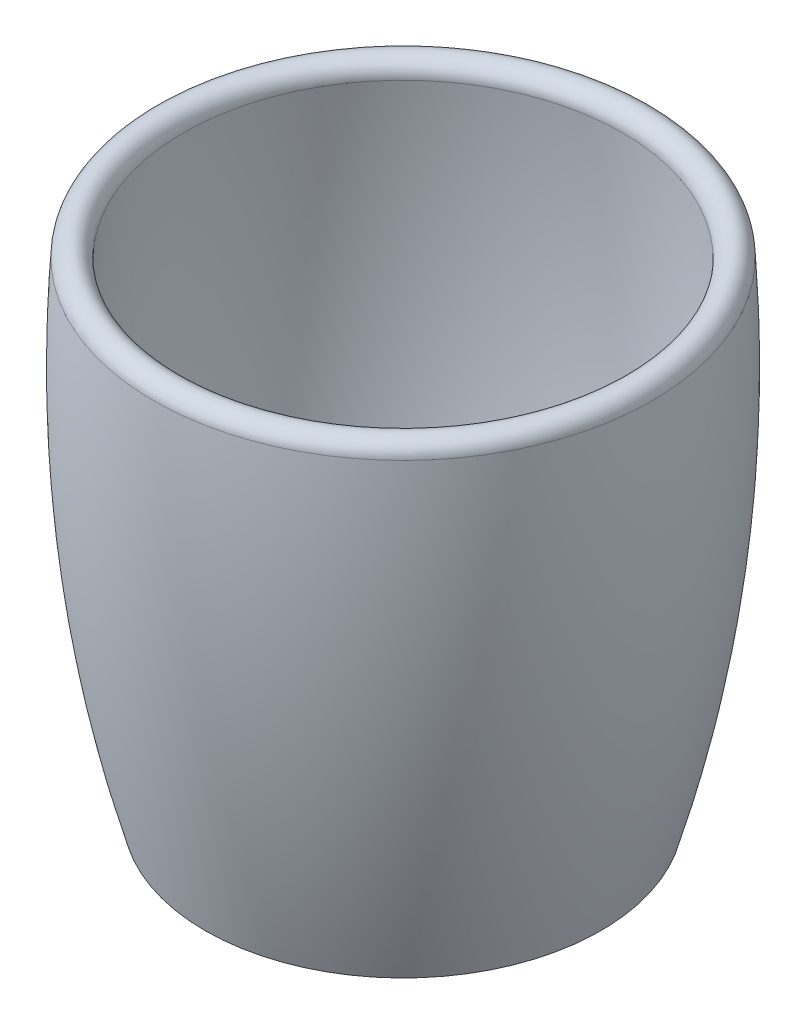
ISO-10303-21;
HEADER;
FILE_DESCRIPTION(('STEP AP214'),'2;1');
FILE_NAME('part.step','',(''),(''),'','','');
FILE_SCHEMA(('AUTOMOTIVE_DESIGN { 1 0 10303 214 1 1 1 1 }'));
ENDSEC;
DATA;
#1=APPLICATION_CONTEXT('core data for automotive mechanical design processes');
#2=APPLICATION_PROTOCOL_DEFINITION('international standard','automotive_design',2000,#1);
#3=PRODUCT_CONTEXT('',#1,'mechanical');
#4=PRODUCT('Part','Part','',(#3));
#5=PRODUCT_RELATED_PRODUCT_CATEGORY('part','',(#4));
#6=PRODUCT_DEFINITION_FORMATION('','',#4);
#7=PRODUCT_DEFINITION_CONTEXT('part definition',#1,'design');
#8=PRODUCT_DEFINITION('design','',#6,#7);
#9=PRODUCT_DEFINITION_SHAPE('','',#8);
#10=(LENGTH_UNIT() NAMED_UNIT(*) SI_UNIT(.MILLI.,.METRE.));
#11=(NAMED_UNIT(*) PLANE_ANGLE_UNIT() SI_UNIT($,.RADIAN.));
#12=(NAMED_UNIT(*) SI_UNIT($,.STERADIAN.) SOLID_ANGLE_UNIT());
#13=UNCERTAINTY_MEASURE_WITH_UNIT(LENGTH_MEASURE(1.E-05),#10,'distance_accuracy_value','');
#14=(GEOMETRIC_REPRESENTATION_CONTEXT(3) GLOBAL_UNCERTAINTY_ASSIGNED_CONTEXT((#13)) GLOBAL_UNIT_ASSIGNED_CONTEXT((#10,
#11,#12)) REPRESENTATION_CONTEXT('',''));
#15=CARTESIAN_POINT('',(0.,0.,0.));
#16=DIRECTION('',(0.,0.,1.));
#17=DIRECTION('',(1.,0.,0.));
#18=AXIS2_PLACEMENT_3D('',#15,#16,#17);
#19=CARTESIAN_POINT('',(0.,5.,0.));
#20=DIRECTION('',(0.,1.,0.));
#21=DIRECTION('',(0.,0.,1.));
#22=AXIS2_PLACEMENT_3D('',#19,#20,#21);
#23=PLANE('',#22);
#24=CARTESIAN_POINT('',(0.,5.,0.));
#25=DIRECTION('',(0.,-1.,0.));
#26=DIRECTION('',(0.,0.,-1.));
#27=AXIS2_PLACEMENT_3D('',#24,#25,#26);
#28=CIRCLE('',#27,29.4504231524279);
#29=CARTESIAN_POINT('',(0.,5.,-29.4504231524279));
#30=VERTEX_POINT('',#29);
#31=EDGE_CURVE('E10',#30,#30,#28,.T.);
#32=ORIENTED_EDGE('',*,*,#31,.F.);
#33=EDGE_LOOP('',(#32));
#34=FACE_BOUND('',#33,.T.);
#35=ADVANCED_FACE('F33',(#34),#23,.T.);
#36=CARTESIAN_POINT('',(36.8601264484739,81.0819403518509,0.));
#37=CARTESIAN_POINT('',(37.06783674226,77.8232808287889,0.));
#38=CARTESIAN_POINT('',(37.3573213885303,71.2744584432907,0.));
#39=CARTESIAN_POINT('',(37.4144319666475,58.3463548968909,0.));
#40=CARTESIAN_POINT('',(36.5162777397363,42.3627053961325,0.));
#41=CARTESIAN_POINT('',(33.8900650254874,23.5134670461146,0.));
#42=CARTESIAN_POINT('',(31.0987213312191,11.1227311945635,0.));
#43=CARTESIAN_POINT('',(29.4504231524279,5.,0.));
#44=B_SPLINE_CURVE_WITH_KNOTS('',3,(#36,#37,#38,#39,#40,#41,#42,#43),.UNSPECIFIED.,.F.,.F.,(4,1,
1,1,1,4),(0.0469513690142024,0.166082447887427,0.285213526760652,0.523475684507101,
0.761737842253551,1.),.UNSPECIFIED.);
#45=CARTESIAN_POINT('',(0.,0.,0.));
#46=DIRECTION('',(0.,-1.,0.));
#47=AXIS1_PLACEMENT('',#45,#46);
#48=SURFACE_OF_REVOLUTION('',#44,#47);
#49=ORIENTED_EDGE('',*,*,#31,.T.);
#50=EDGE_LOOP('',(#49));
#51=FACE_BOUND('',#50,.T.);
#52=CARTESIAN_POINT('',(0.,81.0819403518509,0.));
#53=DIRECTION('',(0.,-1.,0.));
#54=DIRECTION('',(0.,0.,-1.));
#55=AXIS2_PLACEMENT_3D('',#52,#53,#54);
#56=CIRCLE('',#55,36.8601264484739);
#57=CARTESIAN_POINT('',(0.,81.0819403518509,-36.8601264484739));
#58=VERTEX_POINT('',#57);
#59=EDGE_CURVE('E39',#58,#58,#56,.T.);
#60=ORIENTED_EDGE('',*,*,#59,.F.);
#61=EDGE_LOOP('',(#60));
#62=FACE_BOUND('',#61,.T.);
#63=ADVANCED_FACE('F62',(#51,#62),#48,.F.);
#64=CARTESIAN_POINT('',(0.,81.2409701759254,0.));
#65=DIRECTION('',(0.,-1.,0.));
#66=DIRECTION('',(0.,0.,-1.));
#67=AXIS2_PLACEMENT_3D('',#64,#65,#66);
#68=TOROIDAL_SURFACE('',#67,39.355063224237,2.5);
#69=ORIENTED_EDGE('',*,*,#59,.T.);
#70=EDGE_LOOP('',(#69));
#71=FACE_BOUND('',#70,.T.);
#72=CARTESIAN_POINT('',(0.,81.4,0.));
#73=DIRECTION('',(0.,-1.,0.));
#74=DIRECTION('',(0.,0.,-1.));
#75=AXIS2_PLACEMENT_3D('',#72,#73,#74);
#76=CIRCLE('',#75,41.85);
#77=CARTESIAN_POINT('',(0.,81.4,-41.85));
#78=VERTEX_POINT('',#77);
#79=EDGE_CURVE('E43',#78,#78,#76,.T.);
#80=ORIENTED_EDGE('',*,*,#79,.F.);
#81=EDGE_LOOP('',(#80));
#82=FACE_BOUND('',#81,.T.);
#83=ADVANCED_FACE('F65',(#71,#82),#68,.T.);
#84=CARTESIAN_POINT('',(33.25,0.,0.));
#85=CARTESIAN_POINT('',(40.7705850821435,26.2273970416013,0.));
#86=CARTESIAN_POINT('',(43.6372517488102,53.3607303749346,0.));
#87=CARTESIAN_POINT('',(41.85,81.4,0.));
#88=B_SPLINE_CURVE_WITH_KNOTS('',3,(#84,#85,#86,#87),.UNSPECIFIED.,.F.,.F.,(4,4),(0.,1.),.UNSPECIFIED.);
#89=CARTESIAN_POINT('',(0.,0.,0.));
#90=DIRECTION('',(0.,-1.,0.));
#91=AXIS1_PLACEMENT('',#89,#90);
#92=SURFACE_OF_REVOLUTION('',#88,#91);
#93=ORIENTED_EDGE('',*,*,#79,.T.);
#94=EDGE_LOOP('',(#93));
#95=FACE_BOUND('',#94,.T.);
#96=CARTESIAN_POINT('',(0.,0.,0.));
#97=DIRECTION('',(0.,-1.,0.));
#98=DIRECTION('',(0.,0.,-1.));
#99=AXIS2_PLACEMENT_3D('',#96,#97,#98);
#100=CIRCLE('',#99,33.25);
#101=CARTESIAN_POINT('',(0.,0.,-33.25));
#102=VERTEX_POINT('',#101);
#103=EDGE_CURVE('E47',#102,#102,#100,.T.);
#104=ORIENTED_EDGE('',*,*,#103,.F.);
#105=EDGE_LOOP('',(#104));
#106=FACE_BOUND('',#105,.T.);
#107=ADVANCED_FACE('F68',(#95,#106),#92,.F.);
#108=CARTESIAN_POINT('',(0.,0.,0.));
#109=DIRECTION('',(0.,-1.,0.));
#110=DIRECTION('',(0.,0.,-1.));
#111=AXIS2_PLACEMENT_3D('',#108,#109,#110);
#112=PLANE('',#111);
#113=ORIENTED_EDGE('',*,*,#103,.T.);
#114=EDGE_LOOP('',(#113));
#115=FACE_BOUND('',#114,.T.);
#116=ADVANCED_FACE('F71',(#115),#112,.T.);
#117=CLOSED_SHELL('',(#35,#63,#83,#107,#116));
#118=MANIFOLD_SOLID_BREP('B2',#117);
#119=ADVANCED_BREP_SHAPE_REPRESENTATION('',(#18,#118),#14);
#120=SHAPE_DEFINITION_REPRESENTATION(#9,#119);
ENDSEC;
END-ISO-10303-21;
